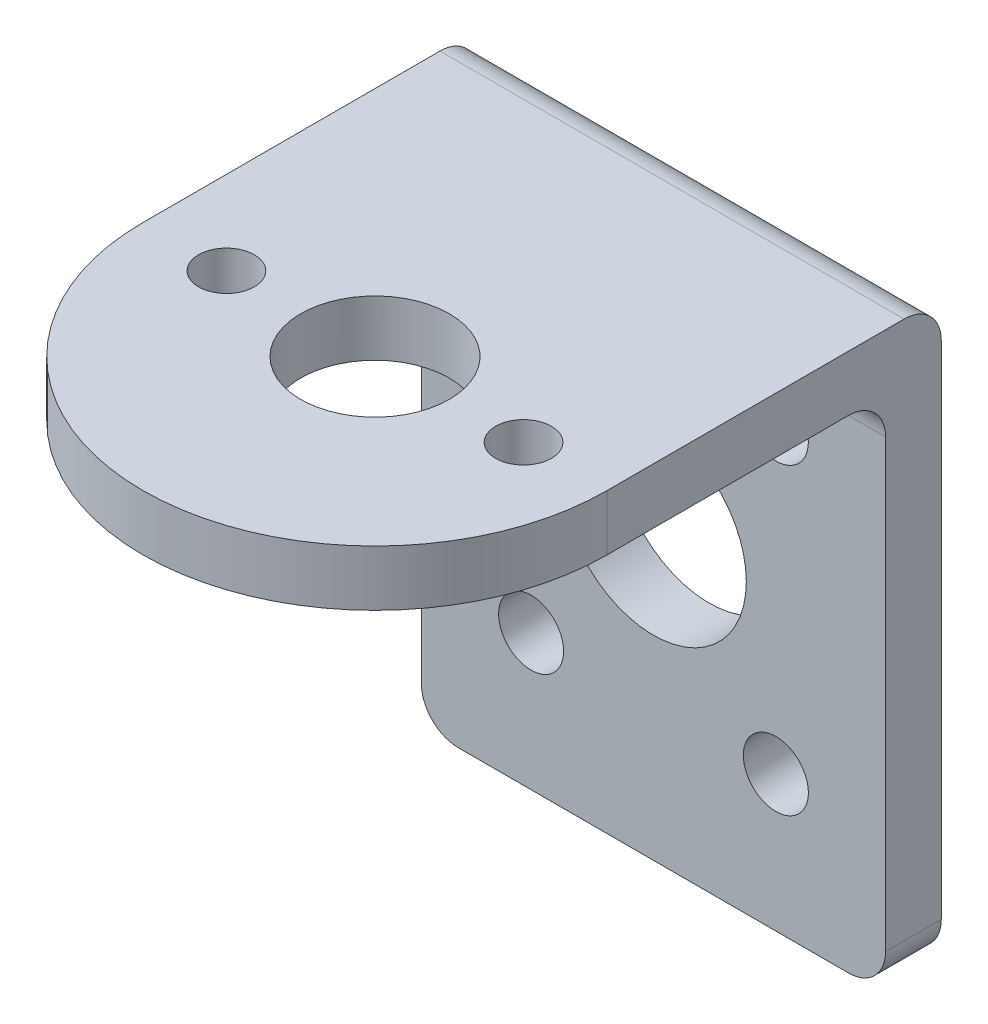
ISO-10303-21;
HEADER;
FILE_DESCRIPTION(('STEP AP214'),'2;1');
FILE_NAME('part.step','',(''),(''),'','','');
FILE_SCHEMA(('AUTOMOTIVE_DESIGN { 1 0 10303 214 1 1 1 1 }'));
ENDSEC;
DATA;
#1=APPLICATION_CONTEXT('core data for automotive mechanical design processes');
#2=APPLICATION_PROTOCOL_DEFINITION('international standard','automotive_design',2000,#1);
#3=PRODUCT_CONTEXT('',#1,'mechanical');
#4=PRODUCT('Part','Part','',(#3));
#5=PRODUCT_RELATED_PRODUCT_CATEGORY('part','',(#4));
#6=PRODUCT_DEFINITION_FORMATION('','',#4);
#7=PRODUCT_DEFINITION_CONTEXT('part definition',#1,'design');
#8=PRODUCT_DEFINITION('design','',#6,#7);
#9=PRODUCT_DEFINITION_SHAPE('','',#8);
#10=(LENGTH_UNIT() NAMED_UNIT(*) SI_UNIT(.MILLI.,.METRE.));
#11=(NAMED_UNIT(*) PLANE_ANGLE_UNIT() SI_UNIT($,.RADIAN.));
#12=(NAMED_UNIT(*) SI_UNIT($,.STERADIAN.) SOLID_ANGLE_UNIT());
#13=UNCERTAINTY_MEASURE_WITH_UNIT(LENGTH_MEASURE(1.E-05),#10,'distance_accuracy_value','');
#14=(GEOMETRIC_REPRESENTATION_CONTEXT(3) GLOBAL_UNCERTAINTY_ASSIGNED_CONTEXT((#13)) GLOBAL_UNIT_ASSIGNED_CONTEXT((#10,
#11,#12)) REPRESENTATION_CONTEXT('',''));
#15=CARTESIAN_POINT('',(0.,0.,0.));
#16=DIRECTION('',(0.,0.,1.));
#17=DIRECTION('',(1.,0.,0.));
#18=AXIS2_PLACEMENT_3D('',#15,#16,#17);
#19=CARTESIAN_POINT('',(25.,15.4243792325056,3.));
#20=DIRECTION('',(-1.,0.,0.));
#21=DIRECTION('',(0.,0.,1.));
#22=AXIS2_PLACEMENT_3D('',#19,#20,#21);
#23=PLANE('',#22);
#24=DIRECTION('',(0.,1.,0.));
#25=VECTOR('',#24,1.);
#26=CARTESIAN_POINT('',(25.,15.4243792325056,3.));
#27=LINE('',#26,#25);
#28=CARTESIAN_POINT('',(25.,-13.5756207674944,3.));
#29=VERTEX_POINT('',#28);
#30=CARTESIAN_POINT('',(25.,10.4243792325056,3.));
#31=VERTEX_POINT('',#30);
#32=EDGE_CURVE('E187',#29,#31,#27,.T.);
#33=ORIENTED_EDGE('',*,*,#32,.F.);
#34=DIRECTION('',(0.,0.,-1.));
#35=VECTOR('',#34,1.);
#36=CARTESIAN_POINT('',(25.,-13.5756207674944,3.));
#37=LINE('',#36,#35);
#38=CARTESIAN_POINT('',(25.,-13.5756207674944,0.));
#39=VERTEX_POINT('',#38);
#40=EDGE_CURVE('E203',#29,#39,#37,.T.);
#41=ORIENTED_EDGE('',*,*,#40,.T.);
#42=DIRECTION('',(0.,1.,0.));
#43=VECTOR('',#42,1.);
#44=CARTESIAN_POINT('',(25.,15.4243792325056,0.));
#45=LINE('',#44,#43);
#46=CARTESIAN_POINT('',(25.,13.4243792325056,0.));
#47=VERTEX_POINT('',#46);
#48=EDGE_CURVE('E184',#39,#47,#45,.T.);
#49=ORIENTED_EDGE('',*,*,#48,.T.);
#50=CARTESIAN_POINT('',(25.,13.4243792325056,2.));
#51=DIRECTION('',(-1.,0.,0.));
#52=DIRECTION('',(0.,0.,1.));
#53=AXIS2_PLACEMENT_3D('',#50,#51,#52);
#54=CIRCLE('',#53,2.);
#55=CARTESIAN_POINT('',(25.,15.4243792325056,2.));
#56=VERTEX_POINT('',#55);
#57=EDGE_CURVE('E201',#47,#56,#54,.F.);
#58=ORIENTED_EDGE('',*,*,#57,.T.);
#59=DIRECTION('',(0.,0.,-1.));
#60=VECTOR('',#59,1.);
#61=CARTESIAN_POINT('',(25.,15.4243792325056,3.));
#62=LINE('',#61,#60);
#63=CARTESIAN_POINT('',(25.0000000239238,15.4243792325056,18.0005468526313));
#64=VERTEX_POINT('',#63);
#65=EDGE_CURVE('E133',#64,#56,#62,.T.);
#66=ORIENTED_EDGE('',*,*,#65,.F.);
#67=DIRECTION('',(0.,-1.,0.));
#68=VECTOR('',#67,1.);
#69=CARTESIAN_POINT('',(25.0000000239238,42.4243792325056,18.0005468526313));
#70=LINE('',#69,#68);
#71=CARTESIAN_POINT('',(25.0000000239238,12.4243792325056,18.0005468526313));
#72=VERTEX_POINT('',#71);
#73=EDGE_CURVE('E119',#64,#72,#70,.T.);
#74=ORIENTED_EDGE('',*,*,#73,.T.);
#75=DIRECTION('',(0.,0.,-1.));
#76=VECTOR('',#75,1.);
#77=CARTESIAN_POINT('',(25.,12.4243792325056,33.));
#78=LINE('',#77,#76);
#79=CARTESIAN_POINT('',(25.,12.4243792325056,5.));
#80=VERTEX_POINT('',#79);
#81=EDGE_CURVE('E131',#72,#80,#78,.T.);
#82=ORIENTED_EDGE('',*,*,#81,.T.);
#83=CARTESIAN_POINT('',(25.,10.4243792325056,5.));
#84=DIRECTION('',(-1.,0.,0.));
#85=DIRECTION('',(0.,0.,1.));
#86=AXIS2_PLACEMENT_3D('',#83,#84,#85);
#87=CIRCLE('',#86,2.);
#88=EDGE_CURVE('E47',#80,#31,#87,.T.);
#89=ORIENTED_EDGE('',*,*,#88,.T.);
#90=EDGE_LOOP('',(#33,#41,#49,#58,#66,#74,#82,#89));
#91=FACE_BOUND('',#90,.T.);
#92=ADVANCED_FACE('F39',(#91),#23,.F.);
#93=CARTESIAN_POINT('',(0.,0.,3.));
#94=DIRECTION('',(0.,0.,1.));
#95=DIRECTION('',(1.,0.,0.));
#96=AXIS2_PLACEMENT_3D('',#93,#94,#95);
#97=PLANE('',#96);
#98=DIRECTION('',(1.,0.,0.));
#99=VECTOR('',#98,1.);
#100=CARTESIAN_POINT('',(0.,-15.5756207674944,3.));
#101=LINE('',#100,#99);
#102=CARTESIAN_POINT('',(2.,-15.5756207674944,3.));
#103=VERTEX_POINT('',#102);
#104=CARTESIAN_POINT('',(23.,-15.5756207674944,3.));
#105=VERTEX_POINT('',#104);
#106=EDGE_CURVE('E183',#103,#105,#101,.T.);
#107=ORIENTED_EDGE('',*,*,#106,.T.);
#108=CARTESIAN_POINT('',(23.,-13.5756207674944,3.));
#109=DIRECTION('',(0.,0.,1.));
#110=DIRECTION('',(1.,0.,0.));
#111=AXIS2_PLACEMENT_3D('',#108,#109,#110);
#112=CIRCLE('',#111,2.);
#113=EDGE_CURVE('E221',#105,#29,#112,.T.);
#114=ORIENTED_EDGE('',*,*,#113,.T.);
#115=ORIENTED_EDGE('',*,*,#32,.T.);
#116=DIRECTION('',(1.,0.,0.));
#117=VECTOR('',#116,1.);
#118=CARTESIAN_POINT('',(0.,10.4243792325056,3.));
#119=LINE('',#118,#117);
#120=CARTESIAN_POINT('',(0.,10.4243792325056,3.));
#121=VERTEX_POINT('',#120);
#122=EDGE_CURVE('E217',#31,#121,#119,.F.);
#123=ORIENTED_EDGE('',*,*,#122,.T.);
#124=DIRECTION('',(0.,-1.,0.));
#125=VECTOR('',#124,1.);
#126=CARTESIAN_POINT('',(0.,15.4243792325056,3.));
#127=LINE('',#126,#125);
#128=CARTESIAN_POINT('',(0.,-13.5756207674944,3.));
#129=VERTEX_POINT('',#128);
#130=EDGE_CURVE('E180',#121,#129,#127,.T.);
#131=ORIENTED_EDGE('',*,*,#130,.T.);
#132=CARTESIAN_POINT('',(2.,-13.5756207674944,3.));
#133=DIRECTION('',(0.,0.,1.));
#134=DIRECTION('',(1.,0.,0.));
#135=AXIS2_PLACEMENT_3D('',#132,#133,#134);
#136=CIRCLE('',#135,2.);
#137=EDGE_CURVE('E219',#129,#103,#136,.T.);
#138=ORIENTED_EDGE('',*,*,#137,.T.);
#139=EDGE_LOOP('',(#107,#114,#115,#123,#131,#138));
#140=FACE_BOUND('',#139,.T.);
#141=CARTESIAN_POINT('',(19.0914007374927,-8.24895768198532,3.));
#142=DIRECTION('',(0.,0.,1.));
#143=DIRECTION('',(-1.,0.,0.));
#144=AXIS2_PLACEMENT_3D('',#141,#142,#143);
#145=CIRCLE('',#144,1.75);
#146=CARTESIAN_POINT('',(17.3414007374927,-8.24895768198532,3.));
#147=VERTEX_POINT('',#146);
#148=EDGE_CURVE('E156',#147,#147,#145,.T.);
#149=ORIENTED_EDGE('',*,*,#148,.F.);
#150=EDGE_LOOP('',(#149));
#151=FACE_BOUND('',#150,.T.);
#152=CARTESIAN_POINT('',(19.0914007374927,8.09771614699659,3.));
#153=DIRECTION('',(0.,0.,1.));
#154=DIRECTION('',(1.,0.,0.));
#155=AXIS2_PLACEMENT_3D('',#152,#153,#154);
#156=CIRCLE('',#155,1.75);
#157=CARTESIAN_POINT('',(20.8414007374927,8.09771614699659,3.));
#158=VERTEX_POINT('',#157);
#159=EDGE_CURVE('E168',#158,#158,#156,.T.);
#160=ORIENTED_EDGE('',*,*,#159,.F.);
#161=EDGE_LOOP('',(#160));
#162=FACE_BOUND('',#161,.T.);
#163=CARTESIAN_POINT('',(12.5,-0.0756207674943634,3.));
#164=DIRECTION('',(0.,0.,1.));
#165=DIRECTION('',(1.,0.,0.));
#166=AXIS2_PLACEMENT_3D('',#163,#164,#165);
#167=CIRCLE('',#166,5.);
#168=CARTESIAN_POINT('',(17.5,-0.0756207674943634,3.));
#169=VERTEX_POINT('',#168);
#170=EDGE_CURVE('E174',#169,#169,#167,.T.);
#171=ORIENTED_EDGE('',*,*,#170,.F.);
#172=EDGE_LOOP('',(#171));
#173=FACE_BOUND('',#172,.T.);
#174=CARTESIAN_POINT('',(5.90859926250729,8.09771614699659,3.));
#175=DIRECTION('',(0.,0.,1.));
#176=DIRECTION('',(-1.,0.,0.));
#177=AXIS2_PLACEMENT_3D('',#174,#175,#176);
#178=CIRCLE('',#177,1.75);
#179=CARTESIAN_POINT('',(4.15859926250729,8.09771614699659,3.));
#180=VERTEX_POINT('',#179);
#181=EDGE_CURVE('E162',#180,#180,#178,.T.);
#182=ORIENTED_EDGE('',*,*,#181,.F.);
#183=EDGE_LOOP('',(#182));
#184=FACE_BOUND('',#183,.T.);
#185=CARTESIAN_POINT('',(5.90859926250729,-8.24895768198532,3.));
#186=DIRECTION('',(0.,0.,1.));
#187=DIRECTION('',(1.,0.,0.));
#188=AXIS2_PLACEMENT_3D('',#185,#186,#187);
#189=CIRCLE('',#188,1.75);
#190=CARTESIAN_POINT('',(7.65859926250729,-8.24895768198532,3.));
#191=VERTEX_POINT('',#190);
#192=EDGE_CURVE('E150',#191,#191,#189,.T.);
#193=ORIENTED_EDGE('',*,*,#192,.F.);
#194=EDGE_LOOP('',(#193));
#195=FACE_BOUND('',#194,.T.);
#196=ADVANCED_FACE('F232',(#140,#151,#162,#173,#184,#195),#97,.T.);
#197=CARTESIAN_POINT('',(0.,0.,0.));
#198=DIRECTION('',(0.,0.,1.));
#199=DIRECTION('',(1.,0.,0.));
#200=AXIS2_PLACEMENT_3D('',#197,#198,#199);
#201=PLANE('',#200);
#202=ORIENTED_EDGE('',*,*,#48,.F.);
#203=CARTESIAN_POINT('',(23.,-13.5756207674944,0.));
#204=DIRECTION('',(0.,0.,1.));
#205=DIRECTION('',(1.,0.,0.));
#206=AXIS2_PLACEMENT_3D('',#203,#204,#205);
#207=CIRCLE('',#206,2.);
#208=CARTESIAN_POINT('',(23.,-15.5756207674944,0.));
#209=VERTEX_POINT('',#208);
#210=EDGE_CURVE('E210',#39,#209,#207,.F.);
#211=ORIENTED_EDGE('',*,*,#210,.T.);
#212=DIRECTION('',(1.,0.,0.));
#213=VECTOR('',#212,1.);
#214=CARTESIAN_POINT('',(0.,-15.5756207674944,0.));
#215=LINE('',#214,#213);
#216=CARTESIAN_POINT('',(2.,-15.5756207674944,0.));
#217=VERTEX_POINT('',#216);
#218=EDGE_CURVE('E193',#217,#209,#215,.T.);
#219=ORIENTED_EDGE('',*,*,#218,.F.);
#220=CARTESIAN_POINT('',(2.,-13.5756207674944,0.));
#221=DIRECTION('',(0.,0.,1.));
#222=DIRECTION('',(1.,0.,0.));
#223=AXIS2_PLACEMENT_3D('',#220,#221,#222);
#224=CIRCLE('',#223,2.);
#225=CARTESIAN_POINT('',(0.,-13.5756207674944,0.));
#226=VERTEX_POINT('',#225);
#227=EDGE_CURVE('E208',#217,#226,#224,.F.);
#228=ORIENTED_EDGE('',*,*,#227,.T.);
#229=DIRECTION('',(0.,-1.,0.));
#230=VECTOR('',#229,1.);
#231=CARTESIAN_POINT('',(0.,15.4243792325056,0.));
#232=LINE('',#231,#230);
#233=CARTESIAN_POINT('',(0.,13.4243792325056,0.));
#234=VERTEX_POINT('',#233);
#235=EDGE_CURVE('E177',#234,#226,#232,.T.);
#236=ORIENTED_EDGE('',*,*,#235,.F.);
#237=DIRECTION('',(-1.,0.,0.));
#238=VECTOR('',#237,1.);
#239=CARTESIAN_POINT('',(0.,13.4243792325056,0.));
#240=LINE('',#239,#238);
#241=EDGE_CURVE('E206',#234,#47,#240,.F.);
#242=ORIENTED_EDGE('',*,*,#241,.T.);
#243=EDGE_LOOP('',(#202,#211,#219,#228,#236,#242));
#244=FACE_BOUND('',#243,.T.);
#245=CARTESIAN_POINT('',(12.5,-0.0756207674943634,0.));
#246=DIRECTION('',(0.,0.,1.));
#247=DIRECTION('',(1.,0.,0.));
#248=AXIS2_PLACEMENT_3D('',#245,#246,#247);
#249=CIRCLE('',#248,5.);
#250=CARTESIAN_POINT('',(17.5,-0.0756207674943634,0.));
#251=VERTEX_POINT('',#250);
#252=EDGE_CURVE('E171',#251,#251,#249,.T.);
#253=ORIENTED_EDGE('',*,*,#252,.T.);
#254=EDGE_LOOP('',(#253));
#255=FACE_BOUND('',#254,.T.);
#256=CARTESIAN_POINT('',(19.0914007374927,8.09771614699659,0.));
#257=DIRECTION('',(0.,0.,1.));
#258=DIRECTION('',(1.,0.,0.));
#259=AXIS2_PLACEMENT_3D('',#256,#257,#258);
#260=CIRCLE('',#259,1.75);
#261=CARTESIAN_POINT('',(20.8414007374927,8.09771614699659,0.));
#262=VERTEX_POINT('',#261);
#263=EDGE_CURVE('E165',#262,#262,#260,.T.);
#264=ORIENTED_EDGE('',*,*,#263,.T.);
#265=EDGE_LOOP('',(#264));
#266=FACE_BOUND('',#265,.T.);
#267=CARTESIAN_POINT('',(5.90859926250729,8.09771614699659,0.));
#268=DIRECTION('',(0.,0.,1.));
#269=DIRECTION('',(-1.,0.,0.));
#270=AXIS2_PLACEMENT_3D('',#267,#268,#269);
#271=CIRCLE('',#270,1.75);
#272=CARTESIAN_POINT('',(4.15859926250729,8.09771614699659,0.));
#273=VERTEX_POINT('',#272);
#274=EDGE_CURVE('E159',#273,#273,#271,.T.);
#275=ORIENTED_EDGE('',*,*,#274,.T.);
#276=EDGE_LOOP('',(#275));
#277=FACE_BOUND('',#276,.T.);
#278=CARTESIAN_POINT('',(19.0914007374927,-8.24895768198532,0.));
#279=DIRECTION('',(0.,0.,1.));
#280=DIRECTION('',(-1.,0.,0.));
#281=AXIS2_PLACEMENT_3D('',#278,#279,#280);
#282=CIRCLE('',#281,1.75);
#283=CARTESIAN_POINT('',(17.3414007374927,-8.24895768198532,0.));
#284=VERTEX_POINT('',#283);
#285=EDGE_CURVE('E153',#284,#284,#282,.T.);
#286=ORIENTED_EDGE('',*,*,#285,.T.);
#287=EDGE_LOOP('',(#286));
#288=FACE_BOUND('',#287,.T.);
#289=CARTESIAN_POINT('',(5.90859926250729,-8.24895768198532,0.));
#290=DIRECTION('',(0.,0.,1.));
#291=DIRECTION('',(1.,0.,0.));
#292=AXIS2_PLACEMENT_3D('',#289,#290,#291);
#293=CIRCLE('',#292,1.75);
#294=CARTESIAN_POINT('',(7.65859926250729,-8.24895768198532,0.));
#295=VERTEX_POINT('',#294);
#296=EDGE_CURVE('E143',#295,#295,#293,.T.);
#297=ORIENTED_EDGE('',*,*,#296,.T.);
#298=EDGE_LOOP('',(#297));
#299=FACE_BOUND('',#298,.T.);
#300=ADVANCED_FACE('F250',(#244,#255,#266,#277,#288,#299),#201,.F.);
#301=CARTESIAN_POINT('',(0.,15.4243792325056,3.));
#302=DIRECTION('',(1.,0.,0.));
#303=DIRECTION('',(0.,0.,-1.));
#304=AXIS2_PLACEMENT_3D('',#301,#302,#303);
#305=PLANE('',#304);
#306=ORIENTED_EDGE('',*,*,#235,.T.);
#307=DIRECTION('',(0.,0.,-1.));
#308=VECTOR('',#307,1.);
#309=CARTESIAN_POINT('',(0.,-13.5756207674944,3.));
#310=LINE('',#309,#308);
#311=EDGE_CURVE('E224',#226,#129,#310,.F.);
#312=ORIENTED_EDGE('',*,*,#311,.T.);
#313=ORIENTED_EDGE('',*,*,#130,.F.);
#314=CARTESIAN_POINT('',(0.,10.4243792325056,5.));
#315=DIRECTION('',(1.,0.,0.));
#316=DIRECTION('',(0.,0.,-1.));
#317=AXIS2_PLACEMENT_3D('',#314,#315,#316);
#318=CIRCLE('',#317,2.);
#319=CARTESIAN_POINT('',(0.,12.4243792325056,5.));
#320=VERTEX_POINT('',#319);
#321=EDGE_CURVE('E11',#121,#320,#318,.T.);
#322=ORIENTED_EDGE('',*,*,#321,.T.);
#323=DIRECTION('',(0.,0.,-1.));
#324=VECTOR('',#323,1.);
#325=CARTESIAN_POINT('',(0.,12.4243792325056,33.));
#326=LINE('',#325,#324);
#327=CARTESIAN_POINT('',(0.,12.4243792325056,18.0005468526313));
#328=VERTEX_POINT('',#327);
#329=EDGE_CURVE('E140',#328,#320,#326,.T.);
#330=ORIENTED_EDGE('',*,*,#329,.F.);
#331=DIRECTION('',(0.,-1.,0.));
#332=VECTOR('',#331,1.);
#333=CARTESIAN_POINT('',(0.,42.4243792325056,18.0005468526313));
#334=LINE('',#333,#332);
#335=CARTESIAN_POINT('',(0.,15.4243792325056,18.0005468526313));
#336=VERTEX_POINT('',#335);
#337=EDGE_CURVE('E122',#336,#328,#334,.T.);
#338=ORIENTED_EDGE('',*,*,#337,.F.);
#339=DIRECTION('',(0.,0.,-1.));
#340=VECTOR('',#339,1.);
#341=CARTESIAN_POINT('',(0.,15.4243792325056,3.));
#342=LINE('',#341,#340);
#343=CARTESIAN_POINT('',(0.,15.4243792325056,2.));
#344=VERTEX_POINT('',#343);
#345=EDGE_CURVE('E190',#336,#344,#342,.T.);
#346=ORIENTED_EDGE('',*,*,#345,.T.);
#347=CARTESIAN_POINT('',(0.,13.4243792325056,2.));
#348=DIRECTION('',(1.,0.,0.));
#349=DIRECTION('',(0.,0.,-1.));
#350=AXIS2_PLACEMENT_3D('',#347,#348,#349);
#351=CIRCLE('',#350,2.);
#352=EDGE_CURVE('E54',#344,#234,#351,.F.);
#353=ORIENTED_EDGE('',*,*,#352,.T.);
#354=EDGE_LOOP('',(#306,#312,#313,#322,#330,#338,#346,#353));
#355=FACE_BOUND('',#354,.T.);
#356=ADVANCED_FACE('F259',(#355),#305,.F.);
#357=CARTESIAN_POINT('',(0.,-15.5756207674944,3.));
#358=DIRECTION('',(0.,1.,0.));
#359=DIRECTION('',(0.,0.,1.));
#360=AXIS2_PLACEMENT_3D('',#357,#358,#359);
#361=PLANE('',#360);
#362=ORIENTED_EDGE('',*,*,#218,.T.);
#363=DIRECTION('',(0.,0.,-1.));
#364=VECTOR('',#363,1.);
#365=CARTESIAN_POINT('',(23.,-15.5756207674944,3.));
#366=LINE('',#365,#364);
#367=EDGE_CURVE('E215',#209,#105,#366,.F.);
#368=ORIENTED_EDGE('',*,*,#367,.T.);
#369=ORIENTED_EDGE('',*,*,#106,.F.);
#370=DIRECTION('',(0.,0.,-1.));
#371=VECTOR('',#370,1.);
#372=CARTESIAN_POINT('',(2.,-15.5756207674944,3.));
#373=LINE('',#372,#371);
#374=EDGE_CURVE('E212',#103,#217,#373,.T.);
#375=ORIENTED_EDGE('',*,*,#374,.T.);
#376=EDGE_LOOP('',(#362,#368,#369,#375));
#377=FACE_BOUND('',#376,.T.);
#378=ADVANCED_FACE('F256',(#377),#361,.F.);
#379=CARTESIAN_POINT('',(0.,15.4243792325056,3.));
#380=DIRECTION('',(0.,-1.,0.));
#381=DIRECTION('',(0.,0.,-1.));
#382=AXIS2_PLACEMENT_3D('',#379,#380,#381);
#383=PLANE('',#382);
#384=CARTESIAN_POINT('',(4.5,15.4243792325056,18.));
#385=DIRECTION('',(0.,-1.,0.));
#386=DIRECTION('',(0.,0.,-1.));
#387=AXIS2_PLACEMENT_3D('',#384,#385,#386);
#388=CIRCLE('',#387,1.5);
#389=CARTESIAN_POINT('',(4.5,15.4243792325056,16.5));
#390=VERTEX_POINT('',#389);
#391=EDGE_CURVE('E141',#390,#390,#388,.T.);
#392=ORIENTED_EDGE('',*,*,#391,.T.);
#393=EDGE_LOOP('',(#392));
#394=FACE_BOUND('',#393,.T.);
#395=CARTESIAN_POINT('',(20.5,15.4243792325056,18.));
#396=DIRECTION('',(0.,-1.,0.));
#397=DIRECTION('',(0.,0.,-1.));
#398=AXIS2_PLACEMENT_3D('',#395,#396,#397);
#399=CIRCLE('',#398,1.5);
#400=CARTESIAN_POINT('',(20.5,15.4243792325056,16.5));
#401=VERTEX_POINT('',#400);
#402=EDGE_CURVE('E146',#401,#401,#399,.T.);
#403=ORIENTED_EDGE('',*,*,#402,.T.);
#404=EDGE_LOOP('',(#403));
#405=FACE_BOUND('',#404,.T.);
#406=CARTESIAN_POINT('',(12.5,15.4243792325056,18.));
#407=DIRECTION('',(0.,-1.,0.));
#408=DIRECTION('',(0.,0.,-1.));
#409=AXIS2_PLACEMENT_3D('',#406,#407,#408);
#410=CIRCLE('',#409,4.);
#411=CARTESIAN_POINT('',(12.5,15.4243792325056,14.));
#412=VERTEX_POINT('',#411);
#413=EDGE_CURVE('E281',#412,#412,#410,.T.);
#414=ORIENTED_EDGE('',*,*,#413,.T.);
#415=EDGE_LOOP('',(#414));
#416=FACE_BOUND('',#415,.T.);
#417=ORIENTED_EDGE('',*,*,#65,.T.);
#418=DIRECTION('',(-1.,0.,0.));
#419=VECTOR('',#418,1.);
#420=CARTESIAN_POINT('',(0.,15.4243792325056,2.));
#421=LINE('',#420,#419);
#422=EDGE_CURVE('E227',#56,#344,#421,.T.);
#423=ORIENTED_EDGE('',*,*,#422,.T.);
#424=ORIENTED_EDGE('',*,*,#345,.F.);
#425=CARTESIAN_POINT('',(12.5000000119619,15.4243792325056,18.0005468526313));
#426=DIRECTION('',(0.,-1.,0.));
#427=DIRECTION('',(0.,0.,-1.));
#428=AXIS2_PLACEMENT_3D('',#425,#426,#427);
#429=CIRCLE('',#428,12.5000000119619);
#430=EDGE_CURVE('E134',#336,#64,#429,.F.);
#431=ORIENTED_EDGE('',*,*,#430,.T.);
#432=EDGE_LOOP('',(#417,#423,#424,#431));
#433=FACE_BOUND('',#432,.T.);
#434=ADVANCED_FACE('F254',(#394,#405,#416,#433),#383,.F.);
#435=CARTESIAN_POINT('',(12.5,-0.0756207674943634,3.));
#436=DIRECTION('',(0.,0.,-1.));
#437=DIRECTION('',(-1.,0.,0.));
#438=AXIS2_PLACEMENT_3D('',#435,#436,#437);
#439=CYLINDRICAL_SURFACE('',#438,5.);
#440=ORIENTED_EDGE('',*,*,#170,.T.);
#441=EDGE_LOOP('',(#440));
#442=FACE_BOUND('',#441,.T.);
#443=ORIENTED_EDGE('',*,*,#252,.F.);
#444=EDGE_LOOP('',(#443));
#445=FACE_BOUND('',#444,.T.);
#446=ADVANCED_FACE('F322',(#442,#445),#439,.F.);
#447=CARTESIAN_POINT('',(19.0914007374927,8.09771614699659,3.));
#448=DIRECTION('',(0.,0.,-1.));
#449=DIRECTION('',(-1.,0.,0.));
#450=AXIS2_PLACEMENT_3D('',#447,#448,#449);
#451=CYLINDRICAL_SURFACE('',#450,1.75);
#452=ORIENTED_EDGE('',*,*,#159,.T.);
#453=EDGE_LOOP('',(#452));
#454=FACE_BOUND('',#453,.T.);
#455=ORIENTED_EDGE('',*,*,#263,.F.);
#456=EDGE_LOOP('',(#455));
#457=FACE_BOUND('',#456,.T.);
#458=ADVANCED_FACE('F318',(#454,#457),#451,.F.);
#459=CARTESIAN_POINT('',(5.90859926250729,8.09771614699659,3.));
#460=DIRECTION('',(0.,0.,-1.));
#461=DIRECTION('',(-1.,0.,0.));
#462=AXIS2_PLACEMENT_3D('',#459,#460,#461);
#463=CYLINDRICAL_SURFACE('',#462,1.75);
#464=ORIENTED_EDGE('',*,*,#181,.T.);
#465=EDGE_LOOP('',(#464));
#466=FACE_BOUND('',#465,.T.);
#467=ORIENTED_EDGE('',*,*,#274,.F.);
#468=EDGE_LOOP('',(#467));
#469=FACE_BOUND('',#468,.T.);
#470=ADVANCED_FACE('F314',(#466,#469),#463,.F.);
#471=CARTESIAN_POINT('',(19.0914007374927,-8.24895768198532,3.));
#472=DIRECTION('',(0.,0.,-1.));
#473=DIRECTION('',(-1.,0.,0.));
#474=AXIS2_PLACEMENT_3D('',#471,#472,#473);
#475=CYLINDRICAL_SURFACE('',#474,1.75);
#476=ORIENTED_EDGE('',*,*,#148,.T.);
#477=EDGE_LOOP('',(#476));
#478=FACE_BOUND('',#477,.T.);
#479=ORIENTED_EDGE('',*,*,#285,.F.);
#480=EDGE_LOOP('',(#479));
#481=FACE_BOUND('',#480,.T.);
#482=ADVANCED_FACE('F310',(#478,#481),#475,.F.);
#483=CARTESIAN_POINT('',(5.90859926250729,-8.24895768198532,3.));
#484=DIRECTION('',(0.,0.,-1.));
#485=DIRECTION('',(-1.,0.,0.));
#486=AXIS2_PLACEMENT_3D('',#483,#484,#485);
#487=CYLINDRICAL_SURFACE('',#486,1.75);
#488=ORIENTED_EDGE('',*,*,#192,.T.);
#489=EDGE_LOOP('',(#488));
#490=FACE_BOUND('',#489,.T.);
#491=ORIENTED_EDGE('',*,*,#296,.F.);
#492=EDGE_LOOP('',(#491));
#493=FACE_BOUND('',#492,.T.);
#494=ADVANCED_FACE('F306',(#490,#493),#487,.F.);
#495=CARTESIAN_POINT('',(0.,12.4243792325056,33.));
#496=DIRECTION('',(0.,1.,0.));
#497=DIRECTION('',(-1.,0.,0.));
#498=AXIS2_PLACEMENT_3D('',#495,#496,#497);
#499=PLANE('',#498);
#500=CARTESIAN_POINT('',(4.5,12.4243792325056,18.));
#501=DIRECTION('',(0.,-1.,0.));
#502=DIRECTION('',(-1.,0.,0.));
#503=AXIS2_PLACEMENT_3D('',#500,#501,#502);
#504=CIRCLE('',#503,1.5);
#505=CARTESIAN_POINT('',(3.,12.4243792325056,18.));
#506=VERTEX_POINT('',#505);
#507=EDGE_CURVE('E478',#506,#506,#504,.T.);
#508=ORIENTED_EDGE('',*,*,#507,.F.);
#509=EDGE_LOOP('',(#508));
#510=FACE_BOUND('',#509,.T.);
#511=CARTESIAN_POINT('',(20.5,12.4243792325056,18.));
#512=DIRECTION('',(0.,-1.,0.));
#513=DIRECTION('',(1.,0.,0.));
#514=AXIS2_PLACEMENT_3D('',#511,#512,#513);
#515=CIRCLE('',#514,1.5);
#516=CARTESIAN_POINT('',(22.,12.4243792325056,18.));
#517=VERTEX_POINT('',#516);
#518=EDGE_CURVE('E481',#517,#517,#515,.T.);
#519=ORIENTED_EDGE('',*,*,#518,.F.);
#520=EDGE_LOOP('',(#519));
#521=FACE_BOUND('',#520,.T.);
#522=CARTESIAN_POINT('',(12.5,12.4243792325056,18.));
#523=DIRECTION('',(0.,-1.,0.));
#524=DIRECTION('',(1.,0.,0.));
#525=AXIS2_PLACEMENT_3D('',#522,#523,#524);
#526=CIRCLE('',#525,4.);
#527=CARTESIAN_POINT('',(16.5,12.4243792325056,18.));
#528=VERTEX_POINT('',#527);
#529=EDGE_CURVE('E125',#528,#528,#526,.T.);
#530=ORIENTED_EDGE('',*,*,#529,.F.);
#531=EDGE_LOOP('',(#530));
#532=FACE_BOUND('',#531,.T.);
#533=ORIENTED_EDGE('',*,*,#329,.T.);
#534=DIRECTION('',(1.,0.,0.));
#535=VECTOR('',#534,1.);
#536=CARTESIAN_POINT('',(0.,12.4243792325056,5.));
#537=LINE('',#536,#535);
#538=EDGE_CURVE('E139',#320,#80,#537,.T.);
#539=ORIENTED_EDGE('',*,*,#538,.T.);
#540=ORIENTED_EDGE('',*,*,#81,.F.);
#541=CARTESIAN_POINT('',(12.5000000119619,12.4243792325056,18.0005468526313));
#542=DIRECTION('',(0.,1.,0.));
#543=DIRECTION('',(-1.,0.,0.));
#544=AXIS2_PLACEMENT_3D('',#541,#542,#543);
#545=CIRCLE('',#544,12.5000000119619);
#546=EDGE_CURVE('E116',#328,#72,#545,.T.);
#547=ORIENTED_EDGE('',*,*,#546,.F.);
#548=EDGE_LOOP('',(#533,#539,#540,#547));
#549=FACE_BOUND('',#548,.T.);
#550=ADVANCED_FACE('F137',(#510,#521,#532,#549),#499,.F.);
#551=CARTESIAN_POINT('',(12.5000000119619,42.4243792325056,18.0005468526313));
#552=DIRECTION('',(0.,-1.,0.));
#553=DIRECTION('',(1.,0.,0.));
#554=AXIS2_PLACEMENT_3D('',#551,#552,#553);
#555=CYLINDRICAL_SURFACE('',#554,12.5000000119619);
#556=ORIENTED_EDGE('',*,*,#337,.T.);
#557=ORIENTED_EDGE('',*,*,#546,.T.);
#558=ORIENTED_EDGE('',*,*,#73,.F.);
#559=ORIENTED_EDGE('',*,*,#430,.F.);
#560=EDGE_LOOP('',(#556,#557,#558,#559));
#561=FACE_BOUND('',#560,.T.);
#562=ADVANCED_FACE('F118',(#561),#555,.T.);
#563=CARTESIAN_POINT('',(12.5,42.4243792325056,18.));
#564=DIRECTION('',(0.,-1.,0.));
#565=DIRECTION('',(1.,0.,0.));
#566=AXIS2_PLACEMENT_3D('',#563,#564,#565);
#567=CYLINDRICAL_SURFACE('',#566,4.);
#568=ORIENTED_EDGE('',*,*,#529,.T.);
#569=EDGE_LOOP('',(#568));
#570=FACE_BOUND('',#569,.T.);
#571=ORIENTED_EDGE('',*,*,#413,.F.);
#572=EDGE_LOOP('',(#571));
#573=FACE_BOUND('',#572,.T.);
#574=ADVANCED_FACE('F292',(#570,#573),#567,.F.);
#575=CARTESIAN_POINT('',(20.5,42.4243792325056,18.));
#576=DIRECTION('',(0.,-1.,0.));
#577=DIRECTION('',(1.,0.,0.));
#578=AXIS2_PLACEMENT_3D('',#575,#576,#577);
#579=CYLINDRICAL_SURFACE('',#578,1.5);
#580=ORIENTED_EDGE('',*,*,#518,.T.);
#581=EDGE_LOOP('',(#580));
#582=FACE_BOUND('',#581,.T.);
#583=ORIENTED_EDGE('',*,*,#402,.F.);
#584=EDGE_LOOP('',(#583));
#585=FACE_BOUND('',#584,.T.);
#586=ADVANCED_FACE('F269',(#582,#585),#579,.F.);
#587=CARTESIAN_POINT('',(4.5,42.4243792325056,18.));
#588=DIRECTION('',(0.,-1.,0.));
#589=DIRECTION('',(1.,0.,0.));
#590=AXIS2_PLACEMENT_3D('',#587,#588,#589);
#591=CYLINDRICAL_SURFACE('',#590,1.5);
#592=ORIENTED_EDGE('',*,*,#507,.T.);
#593=EDGE_LOOP('',(#592));
#594=FACE_BOUND('',#593,.T.);
#595=ORIENTED_EDGE('',*,*,#391,.F.);
#596=EDGE_LOOP('',(#595));
#597=FACE_BOUND('',#596,.T.);
#598=ADVANCED_FACE('F264',(#594,#597),#591,.F.);
#599=CARTESIAN_POINT('',(23.,-13.5756207674944,3.));
#600=DIRECTION('',(0.,0.,-1.));
#601=DIRECTION('',(-1.,0.,0.));
#602=AXIS2_PLACEMENT_3D('',#599,#600,#601);
#603=CYLINDRICAL_SURFACE('',#602,2.);
#604=ORIENTED_EDGE('',*,*,#113,.F.);
#605=ORIENTED_EDGE('',*,*,#367,.F.);
#606=ORIENTED_EDGE('',*,*,#210,.F.);
#607=ORIENTED_EDGE('',*,*,#40,.F.);
#608=EDGE_LOOP('',(#604,#605,#606,#607));
#609=FACE_BOUND('',#608,.T.);
#610=ADVANCED_FACE('F242',(#609),#603,.T.);
#611=CARTESIAN_POINT('',(2.,-13.5756207674944,3.));
#612=DIRECTION('',(0.,0.,-1.));
#613=DIRECTION('',(-1.,0.,0.));
#614=AXIS2_PLACEMENT_3D('',#611,#612,#613);
#615=CYLINDRICAL_SURFACE('',#614,2.);
#616=ORIENTED_EDGE('',*,*,#137,.F.);
#617=ORIENTED_EDGE('',*,*,#311,.F.);
#618=ORIENTED_EDGE('',*,*,#227,.F.);
#619=ORIENTED_EDGE('',*,*,#374,.F.);
#620=EDGE_LOOP('',(#616,#617,#618,#619));
#621=FACE_BOUND('',#620,.T.);
#622=ADVANCED_FACE('F237',(#621),#615,.T.);
#623=CARTESIAN_POINT('',(0.,10.4243792325056,5.));
#624=DIRECTION('',(1.,0.,0.));
#625=DIRECTION('',(0.,1.,0.));
#626=AXIS2_PLACEMENT_3D('',#623,#624,#625);
#627=CYLINDRICAL_SURFACE('',#626,2.);
#628=ORIENTED_EDGE('',*,*,#321,.F.);
#629=ORIENTED_EDGE('',*,*,#122,.F.);
#630=ORIENTED_EDGE('',*,*,#88,.F.);
#631=ORIENTED_EDGE('',*,*,#538,.F.);
#632=EDGE_LOOP('',(#628,#629,#630,#631));
#633=FACE_BOUND('',#632,.T.);
#634=ADVANCED_FACE('F235',(#633),#627,.F.);
#635=CARTESIAN_POINT('',(0.,13.4243792325056,2.));
#636=DIRECTION('',(-1.,0.,0.));
#637=DIRECTION('',(0.,0.,1.));
#638=AXIS2_PLACEMENT_3D('',#635,#636,#637);
#639=CYLINDRICAL_SURFACE('',#638,2.);
#640=ORIENTED_EDGE('',*,*,#57,.F.);
#641=ORIENTED_EDGE('',*,*,#241,.F.);
#642=ORIENTED_EDGE('',*,*,#352,.F.);
#643=ORIENTED_EDGE('',*,*,#422,.F.);
#644=EDGE_LOOP('',(#640,#641,#642,#643));
#645=FACE_BOUND('',#644,.T.);
#646=ADVANCED_FACE('F41',(#645),#639,.T.);
#647=CLOSED_SHELL('',(#92,#196,#300,#356,#378,#434,#446,#458,#470,#482,#494,#550,#562,#574,#586,
#598,#610,#622,#634,#646));
#648=MANIFOLD_SOLID_BREP('B2',#647);
#649=ADVANCED_BREP_SHAPE_REPRESENTATION('',(#18,#648),#14);
#650=SHAPE_DEFINITION_REPRESENTATION(#9,#649);
ENDSEC;
END-ISO-10303-21;
